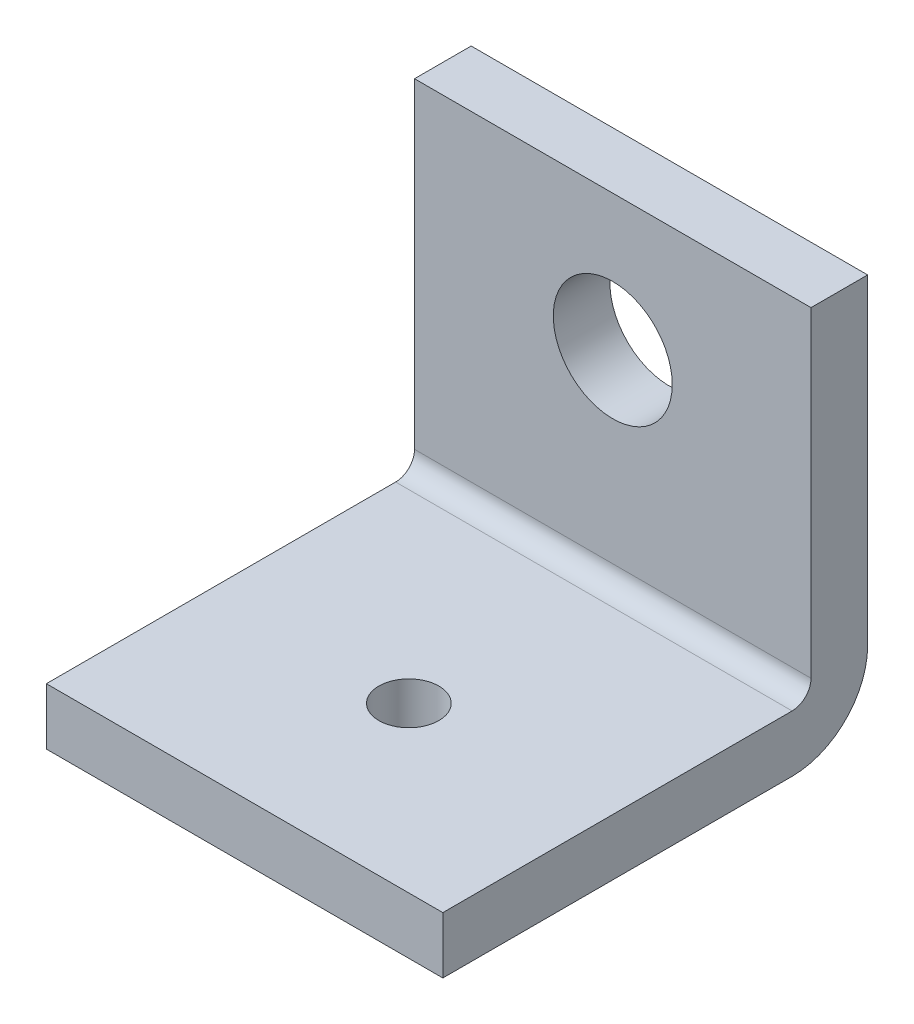
ISO-10303-21;
HEADER;
FILE_DESCRIPTION(('STEP AP214'),'2;1');
FILE_NAME('part.step','',(''),(''),'','','');
FILE_SCHEMA(('AUTOMOTIVE_DESIGN { 1 0 10303 214 1 1 1 1 }'));
ENDSEC;
DATA;
#1=APPLICATION_CONTEXT('core data for automotive mechanical design processes');
#2=APPLICATION_PROTOCOL_DEFINITION('international standard','automotive_design',2000,#1);
#3=PRODUCT_CONTEXT('',#1,'mechanical');
#4=PRODUCT('Part','Part','',(#3));
#5=PRODUCT_RELATED_PRODUCT_CATEGORY('part','',(#4));
#6=PRODUCT_DEFINITION_FORMATION('','',#4);
#7=PRODUCT_DEFINITION_CONTEXT('part definition',#1,'design');
#8=PRODUCT_DEFINITION('design','',#6,#7);
#9=PRODUCT_DEFINITION_SHAPE('','',#8);
#10=(LENGTH_UNIT() NAMED_UNIT(*) SI_UNIT(.MILLI.,.METRE.));
#11=(NAMED_UNIT(*) PLANE_ANGLE_UNIT() SI_UNIT($,.RADIAN.));
#12=(NAMED_UNIT(*) SI_UNIT($,.STERADIAN.) SOLID_ANGLE_UNIT());
#13=UNCERTAINTY_MEASURE_WITH_UNIT(LENGTH_MEASURE(1.E-05),#10,'distance_accuracy_value','');
#14=(GEOMETRIC_REPRESENTATION_CONTEXT(3) GLOBAL_UNCERTAINTY_ASSIGNED_CONTEXT((#13)) GLOBAL_UNIT_ASSIGNED_CONTEXT((#10,
#11,#12)) REPRESENTATION_CONTEXT('',''));
#15=CARTESIAN_POINT('',(0.,0.,0.));
#16=DIRECTION('',(0.,0.,1.));
#17=DIRECTION('',(1.,0.,0.));
#18=AXIS2_PLACEMENT_3D('',#15,#16,#17);
#19=CARTESIAN_POINT('',(21.,21.,3.));
#20=DIRECTION('',(0.,-1.,0.));
#21=DIRECTION('',(0.,0.,-1.));
#22=AXIS2_PLACEMENT_3D('',#19,#20,#21);
#23=PLANE('',#22);
#24=DIRECTION('',(0.,0.,1.));
#25=VECTOR('',#24,1.);
#26=CARTESIAN_POINT('',(0.,21.,3.));
#27=LINE('',#26,#25);
#28=CARTESIAN_POINT('',(0.,21.,0.));
#29=VERTEX_POINT('',#28);
#30=CARTESIAN_POINT('',(0.,21.,3.));
#31=VERTEX_POINT('',#30);
#32=EDGE_CURVE('E127',#29,#31,#27,.T.);
#33=ORIENTED_EDGE('',*,*,#32,.T.);
#34=DIRECTION('',(-1.,0.,0.));
#35=VECTOR('',#34,1.);
#36=CARTESIAN_POINT('',(21.,21.,3.));
#37=LINE('',#36,#35);
#38=CARTESIAN_POINT('',(21.,21.,3.));
#39=VERTEX_POINT('',#38);
#40=EDGE_CURVE('E11',#39,#31,#37,.T.);
#41=ORIENTED_EDGE('',*,*,#40,.F.);
#42=DIRECTION('',(0.,0.,1.));
#43=VECTOR('',#42,1.);
#44=CARTESIAN_POINT('',(21.,21.,3.));
#45=LINE('',#44,#43);
#46=CARTESIAN_POINT('',(21.,21.,0.));
#47=VERTEX_POINT('',#46);
#48=EDGE_CURVE('E142',#47,#39,#45,.T.);
#49=ORIENTED_EDGE('',*,*,#48,.F.);
#50=DIRECTION('',(-1.,0.,0.));
#51=VECTOR('',#50,1.);
#52=CARTESIAN_POINT('',(21.,21.,0.));
#53=LINE('',#52,#51);
#54=EDGE_CURVE('E123',#47,#29,#53,.T.);
#55=ORIENTED_EDGE('',*,*,#54,.T.);
#56=EDGE_LOOP('',(#33,#41,#49,#55));
#57=FACE_BOUND('',#56,.T.);
#58=ADVANCED_FACE('F31',(#57),#23,.F.);
#59=CARTESIAN_POINT('',(21.,4.00000000000001,3.));
#60=DIRECTION('',(0.,0.,-1.));
#61=DIRECTION('',(0.,1.,0.));
#62=AXIS2_PLACEMENT_3D('',#59,#60,#61);
#63=PLANE('',#62);
#64=CARTESIAN_POINT('',(10.5,13.8,3.));
#65=DIRECTION('',(0.,0.,1.));
#66=DIRECTION('',(1.,0.,0.));
#67=AXIS2_PLACEMENT_3D('',#64,#65,#66);
#68=CIRCLE('',#67,3.15);
#69=CARTESIAN_POINT('',(13.65,13.8,3.));
#70=VERTEX_POINT('',#69);
#71=EDGE_CURVE('E183',#70,#70,#68,.T.);
#72=ORIENTED_EDGE('',*,*,#71,.F.);
#73=EDGE_LOOP('',(#72));
#74=FACE_BOUND('',#73,.T.);
#75=DIRECTION('',(0.,-1.,0.));
#76=VECTOR('',#75,1.);
#77=CARTESIAN_POINT('',(0.,4.00000000000001,3.));
#78=LINE('',#77,#76);
#79=CARTESIAN_POINT('',(0.,4.00000000000001,3.));
#80=VERTEX_POINT('',#79);
#81=EDGE_CURVE('E130',#31,#80,#78,.T.);
#82=ORIENTED_EDGE('',*,*,#81,.T.);
#83=DIRECTION('',(-1.,0.,0.));
#84=VECTOR('',#83,1.);
#85=CARTESIAN_POINT('',(21.,4.00000000000001,3.));
#86=LINE('',#85,#84);
#87=CARTESIAN_POINT('',(21.,4.00000000000001,3.));
#88=VERTEX_POINT('',#87);
#89=EDGE_CURVE('E39',#88,#80,#86,.T.);
#90=ORIENTED_EDGE('',*,*,#89,.F.);
#91=DIRECTION('',(0.,-1.,0.));
#92=VECTOR('',#91,1.);
#93=CARTESIAN_POINT('',(21.,4.00000000000001,3.));
#94=LINE('',#93,#92);
#95=EDGE_CURVE('E90',#39,#88,#94,.T.);
#96=ORIENTED_EDGE('',*,*,#95,.F.);
#97=ORIENTED_EDGE('',*,*,#40,.T.);
#98=EDGE_LOOP('',(#82,#90,#96,#97));
#99=FACE_BOUND('',#98,.T.);
#100=ADVANCED_FACE('F189',(#74,#99),#63,.F.);
#101=CARTESIAN_POINT('',(21.,4.,4.));
#102=DIRECTION('',(-1.,0.,0.));
#103=DIRECTION('',(0.,0.,1.));
#104=AXIS2_PLACEMENT_3D('',#101,#102,#103);
#105=CYLINDRICAL_SURFACE('',#104,1.);
#106=CARTESIAN_POINT('',(0.,4.,4.));
#107=DIRECTION('',(-1.,0.,0.));
#108=DIRECTION('',(0.,0.,1.));
#109=AXIS2_PLACEMENT_3D('',#106,#107,#108);
#110=CIRCLE('',#109,1.);
#111=CARTESIAN_POINT('',(0.,3.,4.00000000000003));
#112=VERTEX_POINT('',#111);
#113=EDGE_CURVE('E133',#80,#112,#110,.T.);
#114=ORIENTED_EDGE('',*,*,#113,.T.);
#115=DIRECTION('',(-1.,0.,0.));
#116=VECTOR('',#115,1.);
#117=CARTESIAN_POINT('',(21.,3.,4.00000000000003));
#118=LINE('',#117,#116);
#119=CARTESIAN_POINT('',(21.,3.,4.00000000000003));
#120=VERTEX_POINT('',#119);
#121=EDGE_CURVE('E149',#120,#112,#118,.T.);
#122=ORIENTED_EDGE('',*,*,#121,.F.);
#123=CARTESIAN_POINT('',(21.,4.,4.));
#124=DIRECTION('',(-1.,0.,0.));
#125=DIRECTION('',(0.,0.,1.));
#126=AXIS2_PLACEMENT_3D('',#123,#124,#125);
#127=CIRCLE('',#126,1.);
#128=EDGE_CURVE('E157',#88,#120,#127,.T.);
#129=ORIENTED_EDGE('',*,*,#128,.F.);
#130=ORIENTED_EDGE('',*,*,#89,.T.);
#131=EDGE_LOOP('',(#114,#122,#129,#130));
#132=FACE_BOUND('',#131,.T.);
#133=ADVANCED_FACE('F155',(#132),#105,.F.);
#134=CARTESIAN_POINT('',(21.,3.,4.00000000000003));
#135=DIRECTION('',(0.,-1.,0.));
#136=DIRECTION('',(0.,0.,-1.));
#137=AXIS2_PLACEMENT_3D('',#134,#135,#136);
#138=PLANE('',#137);
#139=CARTESIAN_POINT('',(10.5,3.,13.8));
#140=DIRECTION('',(0.,1.,0.));
#141=DIRECTION('',(0.,0.,1.));
#142=AXIS2_PLACEMENT_3D('',#139,#140,#141);
#143=CIRCLE('',#142,1.5875);
#144=CARTESIAN_POINT('',(10.5,3.,15.3875));
#145=VERTEX_POINT('',#144);
#146=EDGE_CURVE('E177',#145,#145,#143,.T.);
#147=ORIENTED_EDGE('',*,*,#146,.F.);
#148=EDGE_LOOP('',(#147));
#149=FACE_BOUND('',#148,.T.);
#150=DIRECTION('',(0.,0.,1.));
#151=VECTOR('',#150,1.);
#152=CARTESIAN_POINT('',(0.,3.,4.00000000000003));
#153=LINE('',#152,#151);
#154=CARTESIAN_POINT('',(0.,3.,22.5));
#155=VERTEX_POINT('',#154);
#156=EDGE_CURVE('E135',#112,#155,#153,.T.);
#157=ORIENTED_EDGE('',*,*,#156,.T.);
#158=DIRECTION('',(-1.,0.,0.));
#159=VECTOR('',#158,1.);
#160=CARTESIAN_POINT('',(21.,3.,22.5));
#161=LINE('',#160,#159);
#162=CARTESIAN_POINT('',(21.,3.,22.5));
#163=VERTEX_POINT('',#162);
#164=EDGE_CURVE('E146',#163,#155,#161,.T.);
#165=ORIENTED_EDGE('',*,*,#164,.F.);
#166=DIRECTION('',(0.,0.,1.));
#167=VECTOR('',#166,1.);
#168=CARTESIAN_POINT('',(21.,3.,4.00000000000003));
#169=LINE('',#168,#167);
#170=EDGE_CURVE('E169',#120,#163,#169,.T.);
#171=ORIENTED_EDGE('',*,*,#170,.F.);
#172=ORIENTED_EDGE('',*,*,#121,.T.);
#173=EDGE_LOOP('',(#157,#165,#171,#172));
#174=FACE_BOUND('',#173,.T.);
#175=ADVANCED_FACE('F165',(#149,#174),#138,.F.);
#176=CARTESIAN_POINT('',(21.,0.,22.5));
#177=DIRECTION('',(0.,0.,-1.));
#178=DIRECTION('',(-1.,0.,0.));
#179=AXIS2_PLACEMENT_3D('',#176,#177,#178);
#180=PLANE('',#179);
#181=DIRECTION('',(0.,-1.,0.));
#182=VECTOR('',#181,1.);
#183=CARTESIAN_POINT('',(0.,0.,22.5));
#184=LINE('',#183,#182);
#185=CARTESIAN_POINT('',(0.,0.,22.5));
#186=VERTEX_POINT('',#185);
#187=EDGE_CURVE('E137',#155,#186,#184,.T.);
#188=ORIENTED_EDGE('',*,*,#187,.T.);
#189=DIRECTION('',(-1.,0.,0.));
#190=VECTOR('',#189,1.);
#191=CARTESIAN_POINT('',(21.,0.,22.5));
#192=LINE('',#191,#190);
#193=CARTESIAN_POINT('',(21.,0.,22.5));
#194=VERTEX_POINT('',#193);
#195=EDGE_CURVE('E118',#194,#186,#192,.T.);
#196=ORIENTED_EDGE('',*,*,#195,.F.);
#197=DIRECTION('',(0.,-1.,0.));
#198=VECTOR('',#197,1.);
#199=CARTESIAN_POINT('',(21.,0.,22.5));
#200=LINE('',#199,#198);
#201=EDGE_CURVE('E109',#163,#194,#200,.T.);
#202=ORIENTED_EDGE('',*,*,#201,.F.);
#203=ORIENTED_EDGE('',*,*,#164,.T.);
#204=EDGE_LOOP('',(#188,#196,#202,#203));
#205=FACE_BOUND('',#204,.T.);
#206=ADVANCED_FACE('F168',(#205),#180,.F.);
#207=CARTESIAN_POINT('',(21.,0.,4.00000000000003));
#208=DIRECTION('',(0.,1.,0.));
#209=DIRECTION('',(0.,0.,1.));
#210=AXIS2_PLACEMENT_3D('',#207,#208,#209);
#211=PLANE('',#210);
#212=CARTESIAN_POINT('',(10.5,0.,13.8));
#213=DIRECTION('',(0.,1.,0.));
#214=DIRECTION('',(0.,0.,1.));
#215=AXIS2_PLACEMENT_3D('',#212,#213,#214);
#216=CIRCLE('',#215,1.5875);
#217=CARTESIAN_POINT('',(10.5,0.,15.3875));
#218=VERTEX_POINT('',#217);
#219=EDGE_CURVE('E131',#218,#218,#216,.F.);
#220=ORIENTED_EDGE('',*,*,#219,.F.);
#221=EDGE_LOOP('',(#220));
#222=FACE_BOUND('',#221,.T.);
#223=DIRECTION('',(0.,0.,-1.));
#224=VECTOR('',#223,1.);
#225=CARTESIAN_POINT('',(0.,0.,4.00000000000003));
#226=LINE('',#225,#224);
#227=CARTESIAN_POINT('',(0.,0.,4.00000000000002));
#228=VERTEX_POINT('',#227);
#229=EDGE_CURVE('E117',#186,#228,#226,.T.);
#230=ORIENTED_EDGE('',*,*,#229,.T.);
#231=DIRECTION('',(-1.,0.,0.));
#232=VECTOR('',#231,1.);
#233=CARTESIAN_POINT('',(21.,0.,4.00000000000002));
#234=LINE('',#233,#232);
#235=CARTESIAN_POINT('',(21.,0.,4.00000000000002));
#236=VERTEX_POINT('',#235);
#237=EDGE_CURVE('E114',#236,#228,#234,.T.);
#238=ORIENTED_EDGE('',*,*,#237,.F.);
#239=DIRECTION('',(0.,0.,-1.));
#240=VECTOR('',#239,1.);
#241=CARTESIAN_POINT('',(21.,0.,4.00000000000003));
#242=LINE('',#241,#240);
#243=EDGE_CURVE('E103',#194,#236,#242,.T.);
#244=ORIENTED_EDGE('',*,*,#243,.F.);
#245=ORIENTED_EDGE('',*,*,#195,.T.);
#246=EDGE_LOOP('',(#230,#238,#244,#245));
#247=FACE_BOUND('',#246,.T.);
#248=ADVANCED_FACE('F115',(#222,#247),#211,.F.);
#249=CARTESIAN_POINT('',(21.,4.,4.));
#250=DIRECTION('',(-1.,0.,0.));
#251=DIRECTION('',(0.,0.,1.));
#252=AXIS2_PLACEMENT_3D('',#249,#250,#251);
#253=CYLINDRICAL_SURFACE('',#252,4.);
#254=CARTESIAN_POINT('',(0.,4.,4.));
#255=DIRECTION('',(1.,0.,0.));
#256=DIRECTION('',(0.,0.,1.));
#257=AXIS2_PLACEMENT_3D('',#254,#255,#256);
#258=CIRCLE('',#257,4.);
#259=CARTESIAN_POINT('',(0.,4.00000000000003,0.));
#260=VERTEX_POINT('',#259);
#261=EDGE_CURVE('E76',#228,#260,#258,.T.);
#262=ORIENTED_EDGE('',*,*,#261,.T.);
#263=DIRECTION('',(-1.,0.,0.));
#264=VECTOR('',#263,1.);
#265=CARTESIAN_POINT('',(21.,4.00000000000003,0.));
#266=LINE('',#265,#264);
#267=CARTESIAN_POINT('',(21.,4.00000000000003,0.));
#268=VERTEX_POINT('',#267);
#269=EDGE_CURVE('E119',#268,#260,#266,.T.);
#270=ORIENTED_EDGE('',*,*,#269,.F.);
#271=CARTESIAN_POINT('',(21.,4.,4.));
#272=DIRECTION('',(1.,0.,0.));
#273=DIRECTION('',(0.,0.,1.));
#274=AXIS2_PLACEMENT_3D('',#271,#272,#273);
#275=CIRCLE('',#274,4.);
#276=EDGE_CURVE('E107',#236,#268,#275,.T.);
#277=ORIENTED_EDGE('',*,*,#276,.F.);
#278=ORIENTED_EDGE('',*,*,#237,.T.);
#279=EDGE_LOOP('',(#262,#270,#277,#278));
#280=FACE_BOUND('',#279,.T.);
#281=ADVANCED_FACE('F121',(#280),#253,.T.);
#282=CARTESIAN_POINT('',(21.,4.00000000000003,0.));
#283=DIRECTION('',(0.,0.,1.));
#284=DIRECTION('',(1.,0.,0.));
#285=AXIS2_PLACEMENT_3D('',#282,#283,#284);
#286=PLANE('',#285);
#287=CARTESIAN_POINT('',(10.5,13.8,0.));
#288=DIRECTION('',(0.,0.,1.));
#289=DIRECTION('',(1.,0.,0.));
#290=AXIS2_PLACEMENT_3D('',#287,#288,#289);
#291=CIRCLE('',#290,3.15);
#292=CARTESIAN_POINT('',(13.65,13.8,0.));
#293=VERTEX_POINT('',#292);
#294=EDGE_CURVE('E180',#293,#293,#291,.F.);
#295=ORIENTED_EDGE('',*,*,#294,.F.);
#296=EDGE_LOOP('',(#295));
#297=FACE_BOUND('',#296,.T.);
#298=DIRECTION('',(0.,1.,0.));
#299=VECTOR('',#298,1.);
#300=CARTESIAN_POINT('',(0.,4.00000000000003,0.));
#301=LINE('',#300,#299);
#302=EDGE_CURVE('E82',#260,#29,#301,.T.);
#303=ORIENTED_EDGE('',*,*,#302,.T.);
#304=ORIENTED_EDGE('',*,*,#54,.F.);
#305=DIRECTION('',(0.,1.,0.));
#306=VECTOR('',#305,1.);
#307=CARTESIAN_POINT('',(21.,4.00000000000003,0.));
#308=LINE('',#307,#306);
#309=EDGE_CURVE('E47',#268,#47,#308,.T.);
#310=ORIENTED_EDGE('',*,*,#309,.F.);
#311=ORIENTED_EDGE('',*,*,#269,.T.);
#312=EDGE_LOOP('',(#303,#304,#310,#311));
#313=FACE_BOUND('',#312,.T.);
#314=ADVANCED_FACE('F194',(#297,#313),#286,.F.);
#315=CARTESIAN_POINT('',(21.,4.,4.));
#316=DIRECTION('',(-1.,0.,0.));
#317=DIRECTION('',(0.,0.,1.));
#318=AXIS2_PLACEMENT_3D('',#315,#316,#317);
#319=PLANE('',#318);
#320=ORIENTED_EDGE('',*,*,#48,.T.);
#321=ORIENTED_EDGE('',*,*,#95,.T.);
#322=ORIENTED_EDGE('',*,*,#128,.T.);
#323=ORIENTED_EDGE('',*,*,#170,.T.);
#324=ORIENTED_EDGE('',*,*,#201,.T.);
#325=ORIENTED_EDGE('',*,*,#243,.T.);
#326=ORIENTED_EDGE('',*,*,#276,.T.);
#327=ORIENTED_EDGE('',*,*,#309,.T.);
#328=EDGE_LOOP('',(#320,#321,#322,#323,#324,#325,#326,#327));
#329=FACE_BOUND('',#328,.T.);
#330=ADVANCED_FACE('F105',(#329),#319,.F.);
#331=CARTESIAN_POINT('',(0.,4.,4.));
#332=DIRECTION('',(-1.,0.,0.));
#333=DIRECTION('',(0.,0.,1.));
#334=AXIS2_PLACEMENT_3D('',#331,#332,#333);
#335=PLANE('',#334);
#336=ORIENTED_EDGE('',*,*,#32,.F.);
#337=ORIENTED_EDGE('',*,*,#302,.F.);
#338=ORIENTED_EDGE('',*,*,#261,.F.);
#339=ORIENTED_EDGE('',*,*,#229,.F.);
#340=ORIENTED_EDGE('',*,*,#187,.F.);
#341=ORIENTED_EDGE('',*,*,#156,.F.);
#342=ORIENTED_EDGE('',*,*,#113,.F.);
#343=ORIENTED_EDGE('',*,*,#81,.F.);
#344=EDGE_LOOP('',(#336,#337,#338,#339,#340,#341,#342,#343));
#345=FACE_BOUND('',#344,.T.);
#346=ADVANCED_FACE('F161',(#345),#335,.T.);
#347=CARTESIAN_POINT('',(10.5,-4.49012806053458,13.8));
#348=DIRECTION('',(0.,1.,0.));
#349=DIRECTION('',(0.,0.,1.));
#350=AXIS2_PLACEMENT_3D('',#347,#348,#349);
#351=CYLINDRICAL_SURFACE('',#350,1.5875);
#352=ORIENTED_EDGE('',*,*,#219,.T.);
#353=EDGE_LOOP('',(#352));
#354=FACE_BOUND('',#353,.T.);
#355=ORIENTED_EDGE('',*,*,#146,.T.);
#356=EDGE_LOOP('',(#355));
#357=FACE_BOUND('',#356,.T.);
#358=ADVANCED_FACE('F259',(#354,#357),#351,.F.);
#359=CARTESIAN_POINT('',(10.5,13.8,-8.90954544295049));
#360=DIRECTION('',(0.,0.,1.));
#361=DIRECTION('',(1.,0.,0.));
#362=AXIS2_PLACEMENT_3D('',#359,#360,#361);
#363=CYLINDRICAL_SURFACE('',#362,3.15);
#364=ORIENTED_EDGE('',*,*,#294,.T.);
#365=EDGE_LOOP('',(#364));
#366=FACE_BOUND('',#365,.T.);
#367=ORIENTED_EDGE('',*,*,#71,.T.);
#368=EDGE_LOOP('',(#367));
#369=FACE_BOUND('',#368,.T.);
#370=ADVANCED_FACE('F187',(#366,#369),#363,.F.);
#371=CLOSED_SHELL('',(#58,#100,#133,#175,#206,#248,#281,#314,#330,#346,#358,#370));
#372=MANIFOLD_SOLID_BREP('B2',#371);
#373=ADVANCED_BREP_SHAPE_REPRESENTATION('',(#18,#372),#14);
#374=SHAPE_DEFINITION_REPRESENTATION(#9,#373);
ENDSEC;
END-ISO-10303-21;
